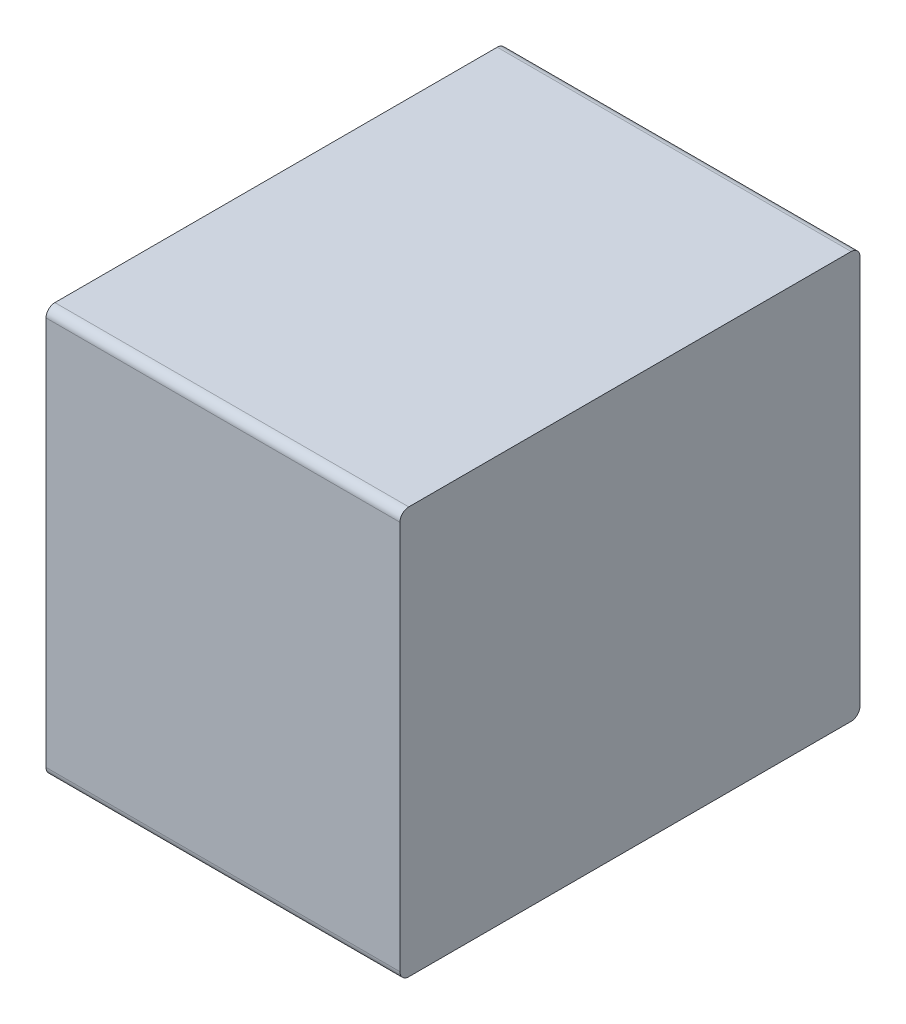
ISO-10303-21;
HEADER;
FILE_DESCRIPTION(('STEP AP214'),'2;1');
FILE_NAME('part.step','',(''),(''),'','','');
FILE_SCHEMA(('AUTOMOTIVE_DESIGN { 1 0 10303 214 1 1 1 1 }'));
ENDSEC;
DATA;
#1=APPLICATION_CONTEXT('core data for automotive mechanical design processes');
#2=APPLICATION_PROTOCOL_DEFINITION('international standard','automotive_design',2000,#1);
#3=PRODUCT_CONTEXT('',#1,'mechanical');
#4=PRODUCT('Part','Part','',(#3));
#5=PRODUCT_RELATED_PRODUCT_CATEGORY('part','',(#4));
#6=PRODUCT_DEFINITION_FORMATION('','',#4);
#7=PRODUCT_DEFINITION_CONTEXT('part definition',#1,'design');
#8=PRODUCT_DEFINITION('design','',#6,#7);
#9=PRODUCT_DEFINITION_SHAPE('','',#8);
#10=(LENGTH_UNIT() NAMED_UNIT(*) SI_UNIT(.MILLI.,.METRE.));
#11=(NAMED_UNIT(*) PLANE_ANGLE_UNIT() SI_UNIT($,.RADIAN.));
#12=(NAMED_UNIT(*) SI_UNIT($,.STERADIAN.) SOLID_ANGLE_UNIT());
#13=UNCERTAINTY_MEASURE_WITH_UNIT(LENGTH_MEASURE(1.E-05),#10,'distance_accuracy_value','');
#14=(GEOMETRIC_REPRESENTATION_CONTEXT(3) GLOBAL_UNCERTAINTY_ASSIGNED_CONTEXT((#13)) GLOBAL_UNIT_ASSIGNED_CONTEXT((#10,
#11,#12)) REPRESENTATION_CONTEXT('',''));
#15=CARTESIAN_POINT('',(0.,0.,0.));
#16=DIRECTION('',(0.,0.,1.));
#17=DIRECTION('',(1.,0.,0.));
#18=AXIS2_PLACEMENT_3D('',#15,#16,#17);
#19=CARTESIAN_POINT('',(-0.5,-0.575,0.05));
#20=DIRECTION('',(1.,0.,0.));
#21=DIRECTION('',(0.,1.,0.));
#22=AXIS2_PLACEMENT_3D('',#19,#20,#21);
#23=PLANE('',#22);
#24=CARTESIAN_POINT('',(-0.5,-0.55,1.325));
#25=DIRECTION('',(-1.,0.,0.));
#26=DIRECTION('',(0.,0.,1.));
#27=AXIS2_PLACEMENT_3D('',#24,#25,#26);
#28=CIRCLE('',#27,0.025);
#29=CARTESIAN_POINT('',(-0.5,-0.575,1.325));
#30=VERTEX_POINT('',#29);
#31=CARTESIAN_POINT('',(-0.5,-0.55,1.35));
#32=VERTEX_POINT('',#31);
#33=EDGE_CURVE('E119',#30,#32,#28,.T.);
#34=ORIENTED_EDGE('',*,*,#33,.T.);
#35=DIRECTION('',(0.,1.,0.));
#36=VECTOR('',#35,1.);
#37=CARTESIAN_POINT('',(-0.5,-0.575,1.35));
#38=LINE('',#37,#36);
#39=CARTESIAN_POINT('',(-0.5,0.55,1.35));
#40=VERTEX_POINT('',#39);
#41=EDGE_CURVE('E137',#32,#40,#38,.T.);
#42=ORIENTED_EDGE('',*,*,#41,.T.);
#43=CARTESIAN_POINT('',(-0.5,0.55,1.325));
#44=DIRECTION('',(1.,0.,0.));
#45=DIRECTION('',(0.,0.,1.));
#46=AXIS2_PLACEMENT_3D('',#43,#44,#45);
#47=CIRCLE('',#46,0.025);
#48=CARTESIAN_POINT('',(-0.5,0.575,1.325));
#49=VERTEX_POINT('',#48);
#50=EDGE_CURVE('E81',#49,#40,#47,.T.);
#51=ORIENTED_EDGE('',*,*,#50,.F.);
#52=DIRECTION('',(0.,0.,1.));
#53=VECTOR('',#52,1.);
#54=CARTESIAN_POINT('',(-0.5,0.575,0.05));
#55=LINE('',#54,#53);
#56=CARTESIAN_POINT('',(-0.5,0.575,0.075));
#57=VERTEX_POINT('',#56);
#58=EDGE_CURVE('E153',#57,#49,#55,.T.);
#59=ORIENTED_EDGE('',*,*,#58,.F.);
#60=CARTESIAN_POINT('',(-0.5,0.55,0.075));
#61=DIRECTION('',(-1.,0.,0.));
#62=DIRECTION('',(0.,0.,1.));
#63=AXIS2_PLACEMENT_3D('',#60,#61,#62);
#64=CIRCLE('',#63,0.025);
#65=CARTESIAN_POINT('',(-0.5,0.55,0.05));
#66=VERTEX_POINT('',#65);
#67=EDGE_CURVE('E93',#57,#66,#64,.T.);
#68=ORIENTED_EDGE('',*,*,#67,.T.);
#69=DIRECTION('',(0.,1.,0.));
#70=VECTOR('',#69,1.);
#71=CARTESIAN_POINT('',(-0.5,-0.575,0.05));
#72=LINE('',#71,#70);
#73=CARTESIAN_POINT('',(-0.5,-0.55,0.05));
#74=VERTEX_POINT('',#73);
#75=EDGE_CURVE('E121',#74,#66,#72,.T.);
#76=ORIENTED_EDGE('',*,*,#75,.F.);
#77=CARTESIAN_POINT('',(-0.5,-0.55,0.075));
#78=DIRECTION('',(1.,0.,0.));
#79=DIRECTION('',(0.,0.,1.));
#80=AXIS2_PLACEMENT_3D('',#77,#78,#79);
#81=CIRCLE('',#80,0.025);
#82=CARTESIAN_POINT('',(-0.5,-0.575,0.075));
#83=VERTEX_POINT('',#82);
#84=EDGE_CURVE('E111',#83,#74,#81,.T.);
#85=ORIENTED_EDGE('',*,*,#84,.F.);
#86=DIRECTION('',(0.,0.,1.));
#87=VECTOR('',#86,1.);
#88=CARTESIAN_POINT('',(-0.5,-0.575,0.05));
#89=LINE('',#88,#87);
#90=EDGE_CURVE('E11',#83,#30,#89,.T.);
#91=ORIENTED_EDGE('',*,*,#90,.T.);
#92=EDGE_LOOP('',(#34,#42,#51,#59,#68,#76,#85,#91));
#93=FACE_BOUND('',#92,.T.);
#94=ADVANCED_FACE('F16',(#93),#23,.F.);
#95=CARTESIAN_POINT('',(-0.5,-0.575,0.05));
#96=DIRECTION('',(0.,1.,0.));
#97=DIRECTION('',(1.,0.,0.));
#98=AXIS2_PLACEMENT_3D('',#95,#96,#97);
#99=PLANE('',#98);
#100=DIRECTION('',(1.,0.,0.));
#101=VECTOR('',#100,1.);
#102=CARTESIAN_POINT('',(-0.5,-0.575,1.325));
#103=LINE('',#102,#101);
#104=CARTESIAN_POINT('',(0.5,-0.575,1.325));
#105=VERTEX_POINT('',#104);
#106=EDGE_CURVE('E124',#30,#105,#103,.T.);
#107=ORIENTED_EDGE('',*,*,#106,.F.);
#108=ORIENTED_EDGE('',*,*,#90,.F.);
#109=DIRECTION('',(1.,0.,0.));
#110=VECTOR('',#109,1.);
#111=CARTESIAN_POINT('',(-0.5,-0.575,0.075));
#112=LINE('',#111,#110);
#113=CARTESIAN_POINT('',(0.5,-0.575,0.075));
#114=VERTEX_POINT('',#113);
#115=EDGE_CURVE('E27',#83,#114,#112,.T.);
#116=ORIENTED_EDGE('',*,*,#115,.T.);
#117=DIRECTION('',(0.,0.,1.));
#118=VECTOR('',#117,1.);
#119=CARTESIAN_POINT('',(0.5,-0.575,0.05));
#120=LINE('',#119,#118);
#121=EDGE_CURVE('E148',#114,#105,#120,.T.);
#122=ORIENTED_EDGE('',*,*,#121,.T.);
#123=EDGE_LOOP('',(#107,#108,#116,#122));
#124=FACE_BOUND('',#123,.T.);
#125=ADVANCED_FACE('F228',(#124),#99,.F.);
#126=CARTESIAN_POINT('',(-0.5,-0.55,0.075));
#127=DIRECTION('',(1.,0.,0.));
#128=DIRECTION('',(0.,-1.,0.));
#129=AXIS2_PLACEMENT_3D('',#126,#127,#128);
#130=CYLINDRICAL_SURFACE('',#129,0.025);
#131=ORIENTED_EDGE('',*,*,#84,.T.);
#132=DIRECTION('',(1.,0.,0.));
#133=VECTOR('',#132,1.);
#134=CARTESIAN_POINT('',(-0.5,-0.55,0.05));
#135=LINE('',#134,#133);
#136=CARTESIAN_POINT('',(0.5,-0.55,0.05));
#137=VERTEX_POINT('',#136);
#138=EDGE_CURVE('E116',#74,#137,#135,.T.);
#139=ORIENTED_EDGE('',*,*,#138,.T.);
#140=CARTESIAN_POINT('',(0.5,-0.55,0.075));
#141=DIRECTION('',(1.,0.,0.));
#142=DIRECTION('',(0.,0.,1.));
#143=AXIS2_PLACEMENT_3D('',#140,#141,#142);
#144=CIRCLE('',#143,0.025);
#145=EDGE_CURVE('E152',#114,#137,#144,.T.);
#146=ORIENTED_EDGE('',*,*,#145,.F.);
#147=ORIENTED_EDGE('',*,*,#115,.F.);
#148=EDGE_LOOP('',(#131,#139,#146,#147));
#149=FACE_BOUND('',#148,.T.);
#150=ADVANCED_FACE('F113',(#149),#130,.T.);
#151=CARTESIAN_POINT('',(-0.5,-0.55,1.325));
#152=DIRECTION('',(1.,0.,0.));
#153=DIRECTION('',(0.,-1.,0.));
#154=AXIS2_PLACEMENT_3D('',#151,#152,#153);
#155=CYLINDRICAL_SURFACE('',#154,0.025);
#156=ORIENTED_EDGE('',*,*,#106,.T.);
#157=CARTESIAN_POINT('',(0.5,-0.55,1.325));
#158=DIRECTION('',(-1.,0.,0.));
#159=DIRECTION('',(0.,0.,1.));
#160=AXIS2_PLACEMENT_3D('',#157,#158,#159);
#161=CIRCLE('',#160,0.025);
#162=CARTESIAN_POINT('',(0.5,-0.55,1.35));
#163=VERTEX_POINT('',#162);
#164=EDGE_CURVE('E168',#105,#163,#161,.T.);
#165=ORIENTED_EDGE('',*,*,#164,.T.);
#166=DIRECTION('',(1.,0.,0.));
#167=VECTOR('',#166,1.);
#168=CARTESIAN_POINT('',(-0.5,-0.55,1.35));
#169=LINE('',#168,#167);
#170=EDGE_CURVE('E131',#32,#163,#169,.T.);
#171=ORIENTED_EDGE('',*,*,#170,.F.);
#172=ORIENTED_EDGE('',*,*,#33,.F.);
#173=EDGE_LOOP('',(#156,#165,#171,#172));
#174=FACE_BOUND('',#173,.T.);
#175=ADVANCED_FACE('F237',(#174),#155,.T.);
#176=CARTESIAN_POINT('',(-0.5,-0.575,0.05));
#177=DIRECTION('',(0.,0.,1.));
#178=DIRECTION('',(1.,0.,0.));
#179=AXIS2_PLACEMENT_3D('',#176,#177,#178);
#180=PLANE('',#179);
#181=DIRECTION('',(1.,0.,0.));
#182=VECTOR('',#181,1.);
#183=CARTESIAN_POINT('',(-0.5,0.55,0.05));
#184=LINE('',#183,#182);
#185=CARTESIAN_POINT('',(0.5,0.55,0.05));
#186=VERTEX_POINT('',#185);
#187=EDGE_CURVE('E144',#66,#186,#184,.T.);
#188=ORIENTED_EDGE('',*,*,#187,.T.);
#189=DIRECTION('',(0.,1.,0.));
#190=VECTOR('',#189,1.);
#191=CARTESIAN_POINT('',(0.5,-0.575,0.05));
#192=LINE('',#191,#190);
#193=EDGE_CURVE('E128',#137,#186,#192,.T.);
#194=ORIENTED_EDGE('',*,*,#193,.F.);
#195=ORIENTED_EDGE('',*,*,#138,.F.);
#196=ORIENTED_EDGE('',*,*,#75,.T.);
#197=EDGE_LOOP('',(#188,#194,#195,#196));
#198=FACE_BOUND('',#197,.T.);
#199=ADVANCED_FACE('F126',(#198),#180,.F.);
#200=CARTESIAN_POINT('',(-0.5,-0.575,1.35));
#201=DIRECTION('',(0.,0.,1.));
#202=DIRECTION('',(1.,0.,0.));
#203=AXIS2_PLACEMENT_3D('',#200,#201,#202);
#204=PLANE('',#203);
#205=ORIENTED_EDGE('',*,*,#41,.F.);
#206=ORIENTED_EDGE('',*,*,#170,.T.);
#207=DIRECTION('',(0.,1.,0.));
#208=VECTOR('',#207,1.);
#209=CARTESIAN_POINT('',(0.5,-0.575,1.35));
#210=LINE('',#209,#208);
#211=CARTESIAN_POINT('',(0.5,0.55,1.35));
#212=VERTEX_POINT('',#211);
#213=EDGE_CURVE('E176',#163,#212,#210,.T.);
#214=ORIENTED_EDGE('',*,*,#213,.T.);
#215=DIRECTION('',(1.,0.,0.));
#216=VECTOR('',#215,1.);
#217=CARTESIAN_POINT('',(-0.5,0.55,1.35));
#218=LINE('',#217,#216);
#219=EDGE_CURVE('E147',#40,#212,#218,.T.);
#220=ORIENTED_EDGE('',*,*,#219,.F.);
#221=EDGE_LOOP('',(#205,#206,#214,#220));
#222=FACE_BOUND('',#221,.T.);
#223=ADVANCED_FACE('F217',(#222),#204,.T.);
#224=CARTESIAN_POINT('',(-0.5,0.55,0.075));
#225=DIRECTION('',(1.,0.,0.));
#226=DIRECTION('',(0.,1.,0.));
#227=AXIS2_PLACEMENT_3D('',#224,#225,#226);
#228=CYLINDRICAL_SURFACE('',#227,0.025);
#229=DIRECTION('',(1.,0.,0.));
#230=VECTOR('',#229,1.);
#231=CARTESIAN_POINT('',(-0.5,0.575,0.075));
#232=LINE('',#231,#230);
#233=CARTESIAN_POINT('',(0.5,0.575,0.075));
#234=VERTEX_POINT('',#233);
#235=EDGE_CURVE('E157',#57,#234,#232,.T.);
#236=ORIENTED_EDGE('',*,*,#235,.T.);
#237=CARTESIAN_POINT('',(0.5,0.55,0.075));
#238=DIRECTION('',(-1.,0.,0.));
#239=DIRECTION('',(0.,0.,1.));
#240=AXIS2_PLACEMENT_3D('',#237,#238,#239);
#241=CIRCLE('',#240,0.025);
#242=EDGE_CURVE('E163',#234,#186,#241,.T.);
#243=ORIENTED_EDGE('',*,*,#242,.T.);
#244=ORIENTED_EDGE('',*,*,#187,.F.);
#245=ORIENTED_EDGE('',*,*,#67,.F.);
#246=EDGE_LOOP('',(#236,#243,#244,#245));
#247=FACE_BOUND('',#246,.T.);
#248=ADVANCED_FACE('F215',(#247),#228,.T.);
#249=CARTESIAN_POINT('',(-0.5,0.55,1.325));
#250=DIRECTION('',(1.,0.,0.));
#251=DIRECTION('',(0.,1.,0.));
#252=AXIS2_PLACEMENT_3D('',#249,#250,#251);
#253=CYLINDRICAL_SURFACE('',#252,0.025);
#254=ORIENTED_EDGE('',*,*,#50,.T.);
#255=ORIENTED_EDGE('',*,*,#219,.T.);
#256=CARTESIAN_POINT('',(0.5,0.55,1.325));
#257=DIRECTION('',(1.,0.,0.));
#258=DIRECTION('',(0.,0.,1.));
#259=AXIS2_PLACEMENT_3D('',#256,#257,#258);
#260=CIRCLE('',#259,0.025);
#261=CARTESIAN_POINT('',(0.5,0.575,1.325));
#262=VERTEX_POINT('',#261);
#263=EDGE_CURVE('E162',#262,#212,#260,.T.);
#264=ORIENTED_EDGE('',*,*,#263,.F.);
#265=DIRECTION('',(1.,0.,0.));
#266=VECTOR('',#265,1.);
#267=CARTESIAN_POINT('',(-0.5,0.575,1.325));
#268=LINE('',#267,#266);
#269=EDGE_CURVE('E20',#49,#262,#268,.T.);
#270=ORIENTED_EDGE('',*,*,#269,.F.);
#271=EDGE_LOOP('',(#254,#255,#264,#270));
#272=FACE_BOUND('',#271,.T.);
#273=ADVANCED_FACE('F211',(#272),#253,.T.);
#274=CARTESIAN_POINT('',(-0.5,0.575,0.05));
#275=DIRECTION('',(0.,1.,0.));
#276=DIRECTION('',(1.,0.,0.));
#277=AXIS2_PLACEMENT_3D('',#274,#275,#276);
#278=PLANE('',#277);
#279=DIRECTION('',(0.,0.,1.));
#280=VECTOR('',#279,1.);
#281=CARTESIAN_POINT('',(0.5,0.575,0.05));
#282=LINE('',#281,#280);
#283=EDGE_CURVE('E158',#234,#262,#282,.T.);
#284=ORIENTED_EDGE('',*,*,#283,.F.);
#285=ORIENTED_EDGE('',*,*,#235,.F.);
#286=ORIENTED_EDGE('',*,*,#58,.T.);
#287=ORIENTED_EDGE('',*,*,#269,.T.);
#288=EDGE_LOOP('',(#284,#285,#286,#287));
#289=FACE_BOUND('',#288,.T.);
#290=ADVANCED_FACE('F209',(#289),#278,.T.);
#291=CARTESIAN_POINT('',(0.5,-0.575,0.05));
#292=DIRECTION('',(1.,0.,0.));
#293=DIRECTION('',(0.,1.,0.));
#294=AXIS2_PLACEMENT_3D('',#291,#292,#293);
#295=PLANE('',#294);
#296=ORIENTED_EDGE('',*,*,#121,.F.);
#297=ORIENTED_EDGE('',*,*,#145,.T.);
#298=ORIENTED_EDGE('',*,*,#193,.T.);
#299=ORIENTED_EDGE('',*,*,#242,.F.);
#300=ORIENTED_EDGE('',*,*,#283,.T.);
#301=ORIENTED_EDGE('',*,*,#263,.T.);
#302=ORIENTED_EDGE('',*,*,#213,.F.);
#303=ORIENTED_EDGE('',*,*,#164,.F.);
#304=EDGE_LOOP('',(#296,#297,#298,#299,#300,#301,#302,#303));
#305=FACE_BOUND('',#304,.T.);
#306=ADVANCED_FACE('F18',(#305),#295,.T.);
#307=CLOSED_SHELL('',(#94,#125,#150,#175,#199,#223,#248,#273,#290,#306));
#308=MANIFOLD_SOLID_BREP('B1',#307);
#309=ADVANCED_BREP_SHAPE_REPRESENTATION('',(#18,#308),#14);
#310=SHAPE_DEFINITION_REPRESENTATION(#9,#309);
ENDSEC;
END-ISO-10303-21;
